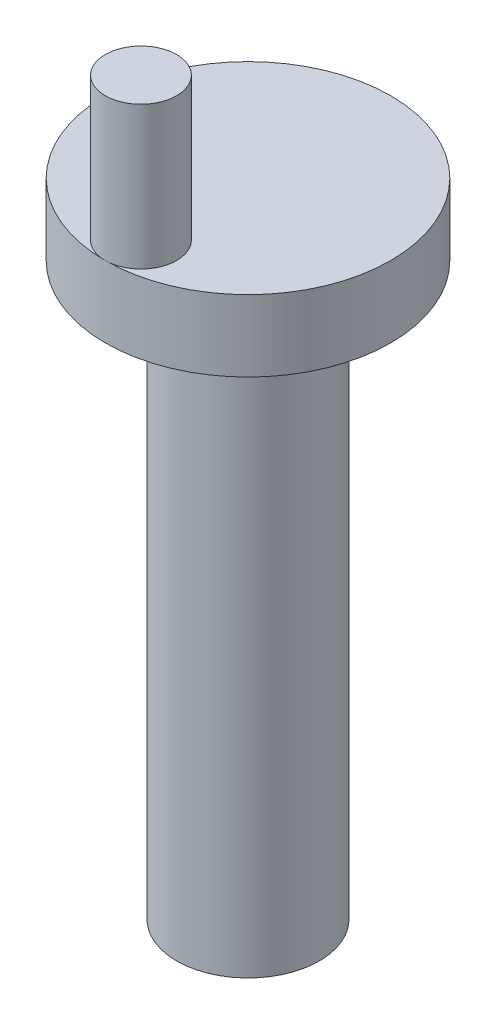
ISO-10303-21;
HEADER;
FILE_DESCRIPTION(('STEP AP214'),'2;1');
FILE_NAME('part.step','',(''),(''),'','','');
FILE_SCHEMA(('AUTOMOTIVE_DESIGN { 1 0 10303 214 1 1 1 1 }'));
ENDSEC;
DATA;
#1=APPLICATION_CONTEXT('core data for automotive mechanical design processes');
#2=APPLICATION_PROTOCOL_DEFINITION('international standard','automotive_design',2000,#1);
#3=PRODUCT_CONTEXT('',#1,'mechanical');
#4=PRODUCT('Part','Part','',(#3));
#5=PRODUCT_RELATED_PRODUCT_CATEGORY('part','',(#4));
#6=PRODUCT_DEFINITION_FORMATION('','',#4);
#7=PRODUCT_DEFINITION_CONTEXT('part definition',#1,'design');
#8=PRODUCT_DEFINITION('design','',#6,#7);
#9=PRODUCT_DEFINITION_SHAPE('','',#8);
#10=(LENGTH_UNIT() NAMED_UNIT(*) SI_UNIT(.MILLI.,.METRE.));
#11=(NAMED_UNIT(*) PLANE_ANGLE_UNIT() SI_UNIT($,.RADIAN.));
#12=(NAMED_UNIT(*) SI_UNIT($,.STERADIAN.) SOLID_ANGLE_UNIT());
#13=UNCERTAINTY_MEASURE_WITH_UNIT(LENGTH_MEASURE(1.E-05),#10,'distance_accuracy_value','');
#14=(GEOMETRIC_REPRESENTATION_CONTEXT(3) GLOBAL_UNCERTAINTY_ASSIGNED_CONTEXT((#13)) GLOBAL_UNIT_ASSIGNED_CONTEXT((#10,
#11,#12)) REPRESENTATION_CONTEXT('',''));
#15=CARTESIAN_POINT('',(0.,0.,0.));
#16=DIRECTION('',(0.,0.,1.));
#17=DIRECTION('',(1.,0.,0.));
#18=AXIS2_PLACEMENT_3D('',#15,#16,#17);
#19=CARTESIAN_POINT('',(0.,20.32,0.));
#20=DIRECTION('',(0.,-1.,0.));
#21=DIRECTION('',(0.,0.,-1.));
#22=AXIS2_PLACEMENT_3D('',#19,#20,#21);
#23=CYLINDRICAL_SURFACE('',#22,2.54);
#24=CARTESIAN_POINT('',(0.,20.32,0.));
#25=DIRECTION('',(0.,1.,0.));
#26=DIRECTION('',(0.,0.,1.));
#27=AXIS2_PLACEMENT_3D('',#24,#25,#26);
#28=CIRCLE('',#27,2.54);
#29=CARTESIAN_POINT('',(0.,20.32,2.54));
#30=VERTEX_POINT('',#29);
#31=EDGE_CURVE('E11',#30,#30,#28,.T.);
#32=ORIENTED_EDGE('',*,*,#31,.F.);
#33=EDGE_LOOP('',(#32));
#34=FACE_BOUND('',#33,.T.);
#35=CARTESIAN_POINT('',(0.,0.,0.));
#36=DIRECTION('',(0.,1.,0.));
#37=DIRECTION('',(0.,0.,1.));
#38=AXIS2_PLACEMENT_3D('',#35,#36,#37);
#39=CIRCLE('',#38,2.54);
#40=CARTESIAN_POINT('',(0.,0.,2.54));
#41=VERTEX_POINT('',#40);
#42=EDGE_CURVE('E42',#41,#41,#39,.T.);
#43=ORIENTED_EDGE('',*,*,#42,.T.);
#44=EDGE_LOOP('',(#43));
#45=FACE_BOUND('',#44,.T.);
#46=ADVANCED_FACE('F39',(#34,#45),#23,.T.);
#47=CARTESIAN_POINT('',(0.,0.,0.));
#48=DIRECTION('',(0.,1.,0.));
#49=DIRECTION('',(0.,0.,1.));
#50=AXIS2_PLACEMENT_3D('',#47,#48,#49);
#51=PLANE('',#50);
#52=ORIENTED_EDGE('',*,*,#42,.F.);
#53=EDGE_LOOP('',(#52));
#54=FACE_BOUND('',#53,.T.);
#55=ADVANCED_FACE('F89',(#54),#51,.F.);
#56=CARTESIAN_POINT('',(0.,22.86,0.));
#57=DIRECTION('',(0.,-1.,0.));
#58=DIRECTION('',(0.,0.,-1.));
#59=AXIS2_PLACEMENT_3D('',#56,#57,#58);
#60=CYLINDRICAL_SURFACE('',#59,5.08);
#61=CARTESIAN_POINT('',(0.,22.86,0.));
#62=DIRECTION('',(0.,1.,0.));
#63=DIRECTION('',(0.,0.,1.));
#64=AXIS2_PLACEMENT_3D('',#61,#62,#63);
#65=CIRCLE('',#64,5.08);
#66=CARTESIAN_POINT('',(0.,22.86,5.08));
#67=VERTEX_POINT('',#66);
#68=EDGE_CURVE('E50',#67,#67,#65,.T.);
#69=ORIENTED_EDGE('',*,*,#68,.F.);
#70=EDGE_LOOP('',(#69));
#71=FACE_BOUND('',#70,.T.);
#72=CARTESIAN_POINT('',(0.,20.32,0.));
#73=DIRECTION('',(0.,1.,0.));
#74=DIRECTION('',(0.,0.,1.));
#75=AXIS2_PLACEMENT_3D('',#72,#73,#74);
#76=CIRCLE('',#75,5.08);
#77=CARTESIAN_POINT('',(0.,20.32,5.08));
#78=VERTEX_POINT('',#77);
#79=EDGE_CURVE('E56',#78,#78,#76,.T.);
#80=ORIENTED_EDGE('',*,*,#79,.T.);
#81=EDGE_LOOP('',(#80));
#82=FACE_BOUND('',#81,.T.);
#83=ADVANCED_FACE('F51',(#71,#82),#60,.T.);
#84=CARTESIAN_POINT('',(0.,22.86,0.));
#85=DIRECTION('',(0.,1.,0.));
#86=DIRECTION('',(0.,0.,1.));
#87=AXIS2_PLACEMENT_3D('',#84,#85,#86);
#88=PLANE('',#87);
#89=ORIENTED_EDGE('',*,*,#68,.T.);
#90=CARTESIAN_POINT('',(0.,22.86,3.81));
#91=DIRECTION('',(0.,1.,0.));
#92=DIRECTION('',(0.,0.,1.));
#93=AXIS2_PLACEMENT_3D('',#90,#91,#92);
#94=CIRCLE('',#93,1.27);
#95=EDGE_CURVE('E65',#67,#67,#94,.T.);
#96=ORIENTED_EDGE('',*,*,#95,.F.);
#97=EDGE_LOOP('',(#89,#96));
#98=FACE_BOUND('',#97,.T.);
#99=ADVANCED_FACE('F80',(#98),#88,.T.);
#100=CARTESIAN_POINT('',(0.,20.32,0.));
#101=DIRECTION('',(0.,1.,0.));
#102=DIRECTION('',(0.,0.,1.));
#103=AXIS2_PLACEMENT_3D('',#100,#101,#102);
#104=PLANE('',#103);
#105=ORIENTED_EDGE('',*,*,#31,.T.);
#106=EDGE_LOOP('',(#105));
#107=FACE_BOUND('',#106,.T.);
#108=ORIENTED_EDGE('',*,*,#79,.F.);
#109=EDGE_LOOP('',(#108));
#110=FACE_BOUND('',#109,.T.);
#111=ADVANCED_FACE('F78',(#107,#110),#104,.F.);
#112=CARTESIAN_POINT('',(0.,27.94,3.81));
#113=DIRECTION('',(0.,-1.,0.));
#114=DIRECTION('',(0.,0.,-1.));
#115=AXIS2_PLACEMENT_3D('',#112,#113,#114);
#116=CYLINDRICAL_SURFACE('',#115,1.27);
#117=CARTESIAN_POINT('',(0.,27.94,3.81));
#118=DIRECTION('',(0.,1.,0.));
#119=DIRECTION('',(0.,0.,1.));
#120=AXIS2_PLACEMENT_3D('',#117,#118,#119);
#121=CIRCLE('',#120,1.27);
#122=CARTESIAN_POINT('',(0.,27.94,5.08));
#123=VERTEX_POINT('',#122);
#124=EDGE_CURVE('E62',#123,#123,#121,.T.);
#125=ORIENTED_EDGE('',*,*,#124,.F.);
#126=EDGE_LOOP('',(#125));
#127=FACE_BOUND('',#126,.T.);
#128=ORIENTED_EDGE('',*,*,#95,.T.);
#129=EDGE_LOOP('',(#128));
#130=FACE_BOUND('',#129,.T.);
#131=ADVANCED_FACE('F75',(#127,#130),#116,.T.);
#132=CARTESIAN_POINT('',(0.,27.94,3.81));
#133=DIRECTION('',(0.,1.,0.));
#134=DIRECTION('',(0.,0.,1.));
#135=AXIS2_PLACEMENT_3D('',#132,#133,#134);
#136=PLANE('',#135);
#137=ORIENTED_EDGE('',*,*,#124,.T.);
#138=EDGE_LOOP('',(#137));
#139=FACE_BOUND('',#138,.T.);
#140=ADVANCED_FACE('F73',(#139),#136,.T.);
#141=CLOSED_SHELL('',(#46,#55,#83,#99,#111,#131,#140));
#142=MANIFOLD_SOLID_BREP('B2',#141);
#143=ADVANCED_BREP_SHAPE_REPRESENTATION('',(#18,#142),#14);
#144=SHAPE_DEFINITION_REPRESENTATION(#9,#143);
ENDSEC;
END-ISO-10303-21;
